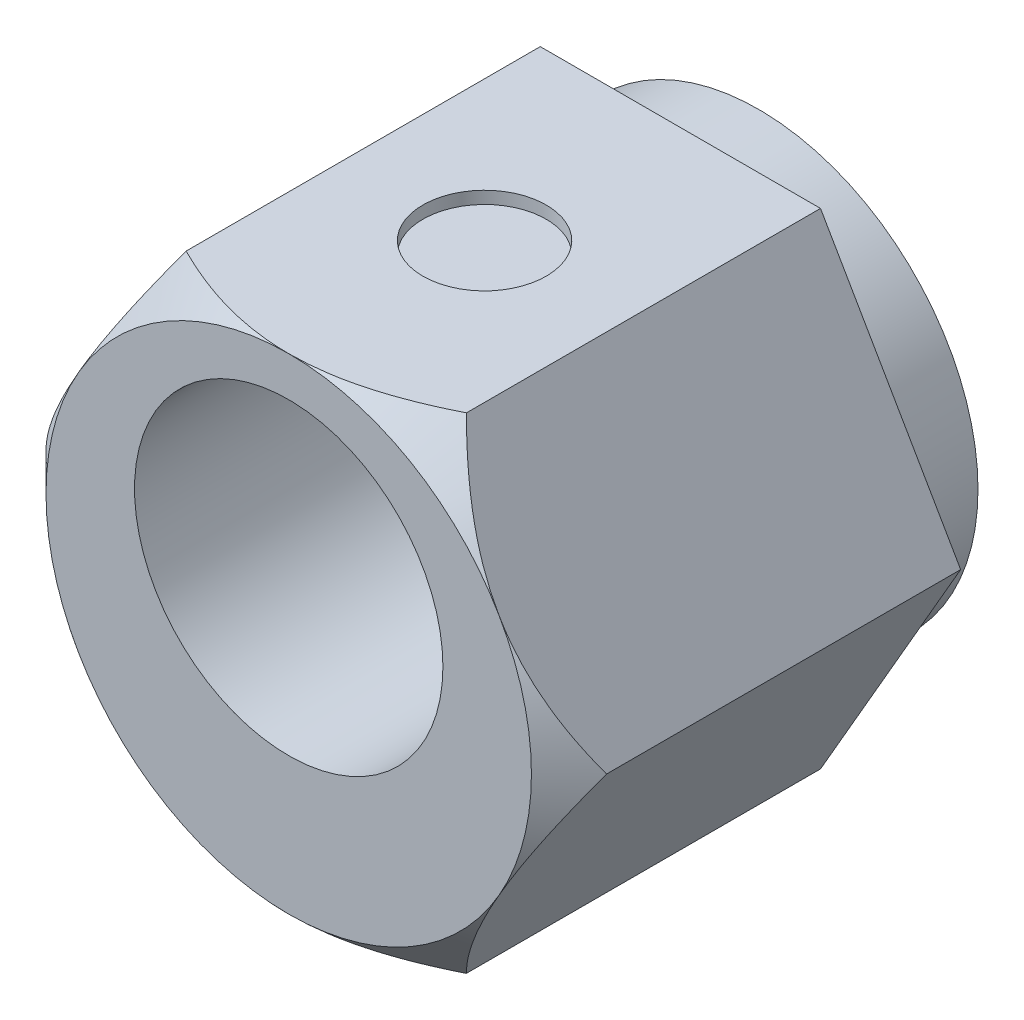
ISO-10303-21;
HEADER;
FILE_DESCRIPTION(('STEP AP214'),'2;1');
FILE_NAME('part.step','',(''),(''),'','','');
FILE_SCHEMA(('AUTOMOTIVE_DESIGN { 1 0 10303 214 1 1 1 1 }'));
ENDSEC;
DATA;
#1=APPLICATION_CONTEXT('core data for automotive mechanical design processes');
#2=APPLICATION_PROTOCOL_DEFINITION('international standard','automotive_design',2000,#1);
#3=PRODUCT_CONTEXT('',#1,'mechanical');
#4=PRODUCT('Part','Part','',(#3));
#5=PRODUCT_RELATED_PRODUCT_CATEGORY('part','',(#4));
#6=PRODUCT_DEFINITION_FORMATION('','',#4);
#7=PRODUCT_DEFINITION_CONTEXT('part definition',#1,'design');
#8=PRODUCT_DEFINITION('design','',#6,#7);
#9=PRODUCT_DEFINITION_SHAPE('','',#8);
#10=(LENGTH_UNIT() NAMED_UNIT(*) SI_UNIT(.MILLI.,.METRE.));
#11=(NAMED_UNIT(*) PLANE_ANGLE_UNIT() SI_UNIT($,.RADIAN.));
#12=(NAMED_UNIT(*) SI_UNIT($,.STERADIAN.) SOLID_ANGLE_UNIT());
#13=UNCERTAINTY_MEASURE_WITH_UNIT(LENGTH_MEASURE(1.E-05),#10,'distance_accuracy_value','');
#14=(GEOMETRIC_REPRESENTATION_CONTEXT(3) GLOBAL_UNCERTAINTY_ASSIGNED_CONTEXT((#13)) GLOBAL_UNIT_ASSIGNED_CONTEXT((#10,
#11,#12)) REPRESENTATION_CONTEXT('',''));
#15=CARTESIAN_POINT('',(0.,0.,0.));
#16=DIRECTION('',(0.,0.,1.));
#17=DIRECTION('',(1.,0.,0.));
#18=AXIS2_PLACEMENT_3D('',#15,#16,#17);
#19=CARTESIAN_POINT('',(2.27187330926118,-3.935,6.35));
#20=DIRECTION('',(-0.866025403784439,0.5,0.));
#21=DIRECTION('',(-0.5,-0.866025403784439,0.));
#22=AXIS2_PLACEMENT_3D('',#19,#20,#21);
#23=PLANE('',#22);
#24=CARTESIAN_POINT('',(2.27175783920734,-3.9352,5.74113790702225));
#25=CARTESIAN_POINT('',(2.31082331662368,-3.86753660829296,5.78019939782444));
#26=CARTESIAN_POINT('',(2.35018773661435,-3.79935543285864,5.81806250313159));
#27=CARTESIAN_POINT('',(2.42957604163856,-3.66185085502993,5.8910266504742));
#28=CARTESIAN_POINT('',(2.46960027263841,-3.59252685340433,5.92612618389363));
#29=CARTESIAN_POINT('',(2.59112694872726,-3.38203647594347,6.02703083232341));
#30=CARTESIAN_POINT('',(2.67366225000178,-3.23908114071799,6.08801147413054));
#31=CARTESIAN_POINT('',(2.84006902700017,-2.950856148233,6.19244398855424));
#32=CARTESIAN_POINT('',(2.9238984692984,-2.8056592950023,6.23615884690859));
#33=CARTESIAN_POINT('',(3.09340844196596,-2.51205940995248,6.30351651032578));
#34=CARTESIAN_POINT('',(3.17908378087713,-2.36366537000264,6.32720957015581));
#35=CARTESIAN_POINT('',(3.3267417531764,-2.10791425983772,6.34858629027159));
#36=CARTESIAN_POINT('',(3.38853414373876,-2.00088669986256,6.35175001817081));
#37=CARTESIAN_POINT('',(3.51201863282563,-1.78700529081743,6.3464170080399));
#38=CARTESIAN_POINT('',(3.57371068860348,-1.68015151578681,6.33791618237832));
#39=CARTESIAN_POINT('',(3.6965102561679,-1.46745642561775,6.30973894507781));
#40=CARTESIAN_POINT('',(3.75761703631313,-1.36161637771927,6.29005003415299));
#41=CARTESIAN_POINT('',(3.87878112158132,-1.15175402598215,6.24057140696216));
#42=CARTESIAN_POINT('',(3.93883850679851,-1.04773158341625,6.21078246514532));
#43=CARTESIAN_POINT('',(4.04545500054664,-0.86306639931963,6.14949467580114));
#44=CARTESIAN_POINT('',(4.09225015435056,-0.782014815383253,6.11960721855959));
#45=CARTESIAN_POINT('',(4.1850004009052,-0.621366675936064,6.05501569852719));
#46=CARTESIAN_POINT('',(4.23095546804853,-0.541770164778593,6.02031148918887));
#47=CARTESIAN_POINT('',(4.32188075595423,-0.384282946433077,5.94686444951026));
#48=CARTESIAN_POINT('',(4.36685356279846,-0.306387760019898,5.90813431896725));
#49=CARTESIAN_POINT('',(4.45596632914802,-0.152039921099436,5.82714402443281));
#50=CARTESIAN_POINT('',(4.50010677953052,-0.0755864183679793,5.78488602621755));
#51=CARTESIAN_POINT('',(4.54386208857619,0.000200000000002672,5.74113790702225));
#52=B_SPLINE_CURVE_WITH_KNOTS('',3,(#24,#25,#26,#27,#28,#29,#30,#31,#32,#33,#34,#35,#36,#37,#38,
#39,#40,#41,#42,#43,#44,#45,#46,#47,#48,#49,#50,#51),.UNSPECIFIED.,.F.,.F.,(4,2,2,2,2,2,2,2,2,2,
2,2,2,4),(0.,0.262034024169244,0.524210113306116,1.05139312717679,1.57020425028876,
2.08770925517824,2.45806190309844,2.82854436754425,3.19944154962779,3.57031029852357,
3.86491210567521,4.15952287791768,4.45323098658818,4.74676009388411),.UNSPECIFIED.);
#53=CARTESIAN_POINT('',(2.27187330926118,-3.935,5.74125338147763));
#54=VERTEX_POINT('',#53);
#55=CARTESIAN_POINT('',(3.40780996389177,-1.9675,6.35));
#56=VERTEX_POINT('',#55);
#57=EDGE_CURVE('E250',#54,#56,#52,.T.);
#58=ORIENTED_EDGE('',*,*,#57,.F.);
#59=DIRECTION('',(0.,0.,-1.));
#60=VECTOR('',#59,1.);
#61=CARTESIAN_POINT('',(2.27187330926118,-3.935,6.35));
#62=LINE('',#61,#60);
#63=CARTESIAN_POINT('',(2.27187330926118,-3.935,0.));
#64=VERTEX_POINT('',#63);
#65=EDGE_CURVE('E224',#54,#64,#62,.T.);
#66=ORIENTED_EDGE('',*,*,#65,.T.);
#67=DIRECTION('',(0.5,0.866025403784439,0.));
#68=VECTOR('',#67,1.);
#69=CARTESIAN_POINT('',(2.27187330926118,-3.935,0.));
#70=LINE('',#69,#68);
#71=CARTESIAN_POINT('',(4.54374661852235,0.,0.));
#72=VERTEX_POINT('',#71);
#73=EDGE_CURVE('E240',#64,#72,#70,.T.);
#74=ORIENTED_EDGE('',*,*,#73,.T.);
#75=DIRECTION('',(0.,0.,-1.));
#76=VECTOR('',#75,1.);
#77=CARTESIAN_POINT('',(4.54374661852235,0.,6.35));
#78=LINE('',#77,#76);
#79=CARTESIAN_POINT('',(4.54374661852235,0.,5.74125338147763));
#80=VERTEX_POINT('',#79);
#81=EDGE_CURVE('E214',#80,#72,#78,.T.);
#82=ORIENTED_EDGE('',*,*,#81,.F.);
#83=EDGE_CURVE('E176',#56,#80,#52,.T.);
#84=ORIENTED_EDGE('',*,*,#83,.F.);
#85=EDGE_LOOP('',(#58,#66,#74,#82,#84));
#86=FACE_BOUND('',#85,.T.);
#87=ADVANCED_FACE('F34',(#86),#23,.F.);
#88=CARTESIAN_POINT('',(4.54374661852235,0.,6.35));
#89=DIRECTION('',(-0.866025403784439,-0.5,0.));
#90=DIRECTION('',(0.5,-0.866025403784439,0.));
#91=AXIS2_PLACEMENT_3D('',#88,#89,#90);
#92=PLANE('',#91);
#93=CARTESIAN_POINT('',(4.54386208857619,-0.00019999999999746,5.74113790702226));
#94=CARTESIAN_POINT('',(4.50479661115985,0.0674633917070432,5.78019939782444));
#95=CARTESIAN_POINT('',(4.46543219116918,0.135644567141366,5.81806250313159));
#96=CARTESIAN_POINT('',(4.38604388614497,0.273149144970073,5.8910266504742));
#97=CARTESIAN_POINT('',(4.34601965514512,0.342473146595676,5.92612618389363));
#98=CARTESIAN_POINT('',(4.22449297905627,0.552963524056532,6.02703083232341));
#99=CARTESIAN_POINT('',(4.14195767778175,0.695918859282011,6.08801147413054));
#100=CARTESIAN_POINT('',(3.97555090078336,0.984143851766998,6.19244398855424));
#101=CARTESIAN_POINT('',(3.89172145848513,1.1293407049977,6.23615884690859));
#102=CARTESIAN_POINT('',(3.72221148581758,1.42294059004751,6.30351651032578));
#103=CARTESIAN_POINT('',(3.6365361469064,1.57133462999736,6.32720957015581));
#104=CARTESIAN_POINT('',(3.48887817460714,1.82708574016228,6.34858629027159));
#105=CARTESIAN_POINT('',(3.42708578404477,1.93411330013744,6.35175001817081));
#106=CARTESIAN_POINT('',(3.30360129495791,2.14799470918257,6.3464170080399));
#107=CARTESIAN_POINT('',(3.24190923918005,2.25484848421319,6.33791618237832));
#108=CARTESIAN_POINT('',(3.11910967161564,2.46754357438224,6.30973894507781));
#109=CARTESIAN_POINT('',(3.0580028914704,2.57338362228073,6.29005003415299));
#110=CARTESIAN_POINT('',(2.93683880620221,2.78324597401784,6.24057140696216));
#111=CARTESIAN_POINT('',(2.87678142098502,2.88726841658375,6.21078246514531));
#112=CARTESIAN_POINT('',(2.77016492723689,3.07193360068037,6.14949467580113));
#113=CARTESIAN_POINT('',(2.72336977343298,3.15298518461674,6.11960721855959));
#114=CARTESIAN_POINT('',(2.63061952687833,3.31363332406393,6.05501569852719));
#115=CARTESIAN_POINT('',(2.58466445973501,3.3932298352214,6.02031148918887));
#116=CARTESIAN_POINT('',(2.4937391718293,3.55071705356692,5.94686444951026));
#117=CARTESIAN_POINT('',(2.44876636498507,3.6286122399801,5.90813431896725));
#118=CARTESIAN_POINT('',(2.35965359863551,3.78296007890056,5.82714402443281));
#119=CARTESIAN_POINT('',(2.31551314825301,3.85941358163202,5.78488602621755));
#120=CARTESIAN_POINT('',(2.27175783920734,3.9352,5.74113790702225));
#121=B_SPLINE_CURVE_WITH_KNOTS('',3,(#93,#94,#95,#96,#97,#98,#99,#100,#101,#102,#103,#104,#105,
#106,#107,#108,#109,#110,#111,#112,#113,#114,#115,#116,#117,#118,#119,#120),.UNSPECIFIED.,.F.,
.F.,(4,2,2,2,2,2,2,2,2,2,2,2,2,4),(0.,0.262034024169244,0.524210113306116,1.05139312717678,
1.57020425028876,2.08770925517823,2.45806190309843,2.82854436754424,3.19944154962778,
3.57031029852356,3.8649121056752,4.15952287791767,4.45323098658817,4.7467600938841),.UNSPECIFIED.);
#122=CARTESIAN_POINT('',(3.40780996389177,1.9675,6.35));
#123=VERTEX_POINT('',#122);
#124=EDGE_CURVE('E174',#80,#123,#121,.T.);
#125=ORIENTED_EDGE('',*,*,#124,.F.);
#126=ORIENTED_EDGE('',*,*,#81,.T.);
#127=DIRECTION('',(-0.5,0.866025403784439,0.));
#128=VECTOR('',#127,1.);
#129=CARTESIAN_POINT('',(4.54374661852235,0.,0.));
#130=LINE('',#129,#128);
#131=CARTESIAN_POINT('',(2.27187330926118,3.935,0.));
#132=VERTEX_POINT('',#131);
#133=EDGE_CURVE('E237',#72,#132,#130,.T.);
#134=ORIENTED_EDGE('',*,*,#133,.T.);
#135=DIRECTION('',(0.,0.,-1.));
#136=VECTOR('',#135,1.);
#137=CARTESIAN_POINT('',(2.27187330926118,3.935,6.35));
#138=LINE('',#137,#136);
#139=CARTESIAN_POINT('',(2.27187330926118,3.935,5.74125338147763));
#140=VERTEX_POINT('',#139);
#141=EDGE_CURVE('E217',#140,#132,#138,.T.);
#142=ORIENTED_EDGE('',*,*,#141,.F.);
#143=EDGE_CURVE('E169',#123,#140,#121,.T.);
#144=ORIENTED_EDGE('',*,*,#143,.F.);
#145=EDGE_LOOP('',(#125,#126,#134,#142,#144));
#146=FACE_BOUND('',#145,.T.);
#147=ADVANCED_FACE('F182',(#146),#92,.F.);
#148=CARTESIAN_POINT('',(2.27187330926118,3.935,6.35));
#149=DIRECTION('',(0.,-1.,0.));
#150=DIRECTION('',(0.,0.,-1.));
#151=AXIS2_PLACEMENT_3D('',#148,#149,#150);
#152=PLANE('',#151);
#153=CARTESIAN_POINT('',(0.,3.935,3.175));
#154=DIRECTION('',(0.,1.,0.));
#155=DIRECTION('',(0.,0.,1.));
#156=AXIS2_PLACEMENT_3D('',#153,#154,#155);
#157=CIRCLE('',#156,1.);
#158=CARTESIAN_POINT('',(0.,3.935,4.175));
#159=VERTEX_POINT('',#158);
#160=EDGE_CURVE('E248',#159,#159,#157,.T.);
#161=ORIENTED_EDGE('',*,*,#160,.F.);
#162=EDGE_LOOP('',(#161));
#163=FACE_BOUND('',#162,.T.);
#164=CARTESIAN_POINT('',(-13.1236901526752,3.935,-3.41592946567602));
#165=CARTESIAN_POINT('',(-12.8031195440559,3.935,-3.10889289114892));
#166=CARTESIAN_POINT('',(-12.4821108648223,3.935,-2.8023113742663));
#167=CARTESIAN_POINT('',(-11.8389221735785,3.935,-2.19034787753257));
#168=CARTESIAN_POINT('',(-11.5167421042617,3.935,-1.88496595793061));
#169=CARTESIAN_POINT('',(-10.8700823429703,3.935,-1.27490570063593));
#170=CARTESIAN_POINT('',(-10.5455988029611,3.935,-0.970231438129506));
#171=CARTESIAN_POINT('',(-9.89478736268741,3.935,-0.362879907042088));
#172=CARTESIAN_POINT('',(-9.56845952755677,3.935,-0.0602025687450328));
#173=CARTESIAN_POINT('',(-8.87472102038576,3.935,0.578081233468633));
#174=CARTESIAN_POINT('',(-8.50700688270092,3.935,0.913358297375564));
#175=CARTESIAN_POINT('',(-7.76731901306219,3.935,1.57929169459804));
#176=CARTESIAN_POINT('',(-7.39534478298294,3.935,1.90994747730821));
#177=CARTESIAN_POINT('',(-6.83307463315123,3.935,2.40040387622325));
#178=CARTESIAN_POINT('',(-6.64508172586861,3.935,2.56284332383779));
#179=CARTESIAN_POINT('',(-6.26720974784876,3.935,2.88551089592677));
#180=CARTESIAN_POINT('',(-6.0773307119418,3.935,3.04573906110586));
#181=CARTESIAN_POINT('',(-5.69527444823266,3.935,3.36335940486739));
#182=CARTESIAN_POINT('',(-5.50309768174997,3.935,3.52075213733078));
#183=CARTESIAN_POINT('',(-5.11582420868297,3.935,3.83189555157435));
#184=CARTESIAN_POINT('',(-4.9207276819186,3.935,3.98564645615061));
#185=CARTESIAN_POINT('',(-4.59066963103563,3.935,4.23923777501762));
#186=CARTESIAN_POINT('',(-4.45672034623056,3.935,4.34039432268771));
#187=CARTESIAN_POINT('',(-4.18679523009464,3.935,4.53998371954863));
#188=CARTESIAN_POINT('',(-4.05081933693232,3.935,4.63841648537453));
#189=CARTESIAN_POINT('',(-3.77620153052435,3.935,4.83207201127131));
#190=CARTESIAN_POINT('',(-3.63755500466042,3.935,4.92728825343199));
#191=CARTESIAN_POINT('',(-3.35739305428911,3.935,5.11340985393257));
#192=CARTESIAN_POINT('',(-3.21587776632741,3.935,5.20431541676518));
#193=CARTESIAN_POINT('',(-2.93248486646283,3.935,5.37873022055762));
#194=CARTESIAN_POINT('',(-2.79067930340835,3.935,5.46235583033874));
#195=CARTESIAN_POINT('',(-2.50319310985428,3.935,5.62281496077693));
#196=CARTESIAN_POINT('',(-2.35751148463348,3.935,5.69964671561026));
#197=CARTESIAN_POINT('',(-2.06226709210795,3.935,5.84420557337593));
#198=CARTESIAN_POINT('',(-1.91271910896614,3.935,5.9119625750583));
#199=CARTESIAN_POINT('',(-1.60896116978889,3.935,6.03602304691689));
#200=CARTESIAN_POINT('',(-1.45475443067069,3.935,6.09233422190501));
#201=CARTESIAN_POINT('',(-1.20045367872989,3.935,6.17200976074409));
#202=CARTESIAN_POINT('',(-1.10174756702824,3.935,6.19981119655868));
#203=CARTESIAN_POINT('',(-0.902705453338799,3.935,6.24893693510281));
#204=CARTESIAN_POINT('',(-0.802369277526225,3.935,6.27026054221768));
#205=CARTESIAN_POINT('',(-0.600677306359168,3.935,6.30565166626418));
#206=CARTESIAN_POINT('',(-0.499324791055474,3.935,6.31973767616047));
#207=CARTESIAN_POINT('',(-0.295844893857511,3.935,6.34019311884467));
#208=CARTESIAN_POINT('',(-0.19371755506928,3.935,6.34656297778597));
#209=CARTESIAN_POINT('',(0.0317597016033228,3.935,6.35179824290066));
#210=CARTESIAN_POINT('',(0.155156367773224,3.935,6.34885168911598));
#211=CARTESIAN_POINT('',(0.401139414943979,3.935,6.33151175443196));
#212=CARTESIAN_POINT('',(0.523725672494003,3.935,6.31711666830712));
#213=CARTESIAN_POINT('',(0.76765747972916,3.935,6.27763599318921));
#214=CARTESIAN_POINT('',(0.888995881860383,3.935,6.25250681522559));
#215=CARTESIAN_POINT('',(1.12929608238302,3.935,6.19281457883945));
#216=CARTESIAN_POINT('',(1.24825763094315,3.935,6.15825053425755));
#217=CARTESIAN_POINT('',(1.60548760242359,3.935,6.04112194575606));
#218=CARTESIAN_POINT('',(1.83964307730525,3.935,5.94593263396749));
#219=CARTESIAN_POINT('',(2.18280484497915,3.935,5.78626578439461));
#220=CARTESIAN_POINT('',(2.29595874697007,3.935,5.73016346030901));
#221=CARTESIAN_POINT('',(2.51984341612594,3.935,5.61330683052985));
#222=CARTESIAN_POINT('',(2.63057453648393,3.935,5.55255320879083));
#223=CARTESIAN_POINT('',(2.8514014363745,3.935,5.42635931686595));
#224=CARTESIAN_POINT('',(2.96146589768556,3.935,5.36086477127302));
#225=CARTESIAN_POINT('',(3.17961590777305,3.935,5.22666129988295));
#226=CARTESIAN_POINT('',(3.28770141327481,3.935,5.15795230391057));
#227=CARTESIAN_POINT('',(3.50203858606768,3.935,5.01794026649113));
#228=CARTESIAN_POINT('',(3.60829177117163,3.935,4.94663954076899));
#229=CARTESIAN_POINT('',(3.81927009139693,3.935,4.80182751727686));
#230=CARTESIAN_POINT('',(3.92399528884536,3.935,4.7283163100496));
#231=CARTESIAN_POINT('',(4.26762948621968,3.935,4.48252454868428));
#232=CARTESIAN_POINT('',(4.50369936164225,3.935,4.30627340705269));
#233=CARTESIAN_POINT('',(4.97067864192371,3.935,3.94704122053123));
#234=CARTESIAN_POINT('',(5.20158705610022,3.935,3.764058901202));
#235=CARTESIAN_POINT('',(5.65961269187026,3.935,3.39316510070156));
#236=CARTESIAN_POINT('',(5.88672773089495,3.935,3.20525093164967));
#237=CARTESIAN_POINT('',(6.33795252588463,3.935,2.82584582987841));
#238=CARTESIAN_POINT('',(6.56206218345843,3.935,2.63435478054663));
#239=CARTESIAN_POINT('',(7.00849695323274,3.935,2.24816692555583));
#240=CARTESIAN_POINT('',(7.23081606517612,3.935,2.05346319618324));
#241=CARTESIAN_POINT('',(7.67357642035214,3.935,1.66192866942992));
#242=CARTESIAN_POINT('',(7.89401763332101,3.935,1.46509783788486));
#243=CARTESIAN_POINT('',(8.55293598005197,3.935,0.872246101755066));
#244=CARTESIAN_POINT('',(8.9891655383951,3.935,0.473728323137581));
#245=CARTESIAN_POINT('',(9.80466067684911,3.935,-0.278818950927105));
#246=CARTESIAN_POINT('',(10.1843882160902,3.935,-0.63235001731397));
#247=CARTESIAN_POINT('',(10.941579142227,3.935,-1.34190416880677));
#248=CARTESIAN_POINT('',(11.3190422963122,3.935,-1.69792750226642));
#249=CARTESIAN_POINT('',(12.0704413810763,3.935,-2.41009605435369));
#250=CARTESIAN_POINT('',(12.4443855483041,3.935,-2.76623259460942));
#251=CARTESIAN_POINT('',(13.1908789142557,3.935,-3.47987607095009));
#252=CARTESIAN_POINT('',(13.5634282742904,3.935,-3.83738283824041));
#253=CARTESIAN_POINT('',(13.935484735638,3.935,-4.19539915945703));
#254=B_SPLINE_CURVE_WITH_KNOTS('',3,(#164,#165,#166,#167,#168,#169,#170,#171,#172,#173,#174,
#175,#176,#177,#178,#179,#180,#181,#182,#183,#184,#185,#186,#187,#188,#189,#190,#191,#192,#193,
#194,#195,#196,#197,#198,#199,#200,#201,#202,#203,#204,#205,#206,#207,#208,#209,#210,#211,#212,
#213,#214,#215,#216,#217,#218,#219,#220,#221,#222,#223,#224,#225,#226,#227,#228,#229,#230,#231,
#232,#233,#234,#235,#236,#237,#238,#239,#240,#241,#242,#243,#244,#245,#246,#247,#248,#249,#250,
#251,#252,#253),.UNSPECIFIED.,.F.,.F.,(4,2,2,2,2,2,2,2,2,2,2,2,2,2,2,2,2,2,2,2,2,2,2,2,2,2,2,2,
2,2,2,2,2,2,2,2,2,2,2,2,2,2,2,2,4),(0.,1.33166737410768,2.66340079661562,3.99870110863636,
5.33395455368537,6.8267872394219,8.31979629882266,9.06513664918736,9.81046326119244,
10.5556426648754,11.3007763623614,11.8043123221086,12.3078636762281,12.8123807031937,
13.3168737725696,13.8106110967637,14.3044763757059,14.7966722298962,15.2885356547855,
15.5959914578669,15.9034802650982,16.2101794433857,16.5168616822885,16.886591181482,
17.256375761122,17.6276764536979,17.9990159705603,18.755162227821,19.1340132033387,
19.5128085769528,19.8969796934452,20.2811592007632,20.66500349517,21.0488320884306,
21.9324494577438,22.8162349955618,23.7005126350207,24.5848191539302,25.4713783562851,
26.3579518192813,28.1304708443723,29.6869288193223,31.2435441676875,32.792736046513,
34.3417428537419),.UNSPECIFIED.);
#255=CARTESIAN_POINT('',(0.,3.935,6.35));
#256=VERTEX_POINT('',#255);
#257=EDGE_CURVE('E175',#140,#256,#254,.F.);
#258=ORIENTED_EDGE('',*,*,#257,.F.);
#259=ORIENTED_EDGE('',*,*,#141,.T.);
#260=DIRECTION('',(-1.,0.,0.));
#261=VECTOR('',#260,1.);
#262=CARTESIAN_POINT('',(2.27187330926118,3.935,0.));
#263=LINE('',#262,#261);
#264=CARTESIAN_POINT('',(-2.27187330926118,3.935,0.));
#265=VERTEX_POINT('',#264);
#266=EDGE_CURVE('E234',#132,#265,#263,.T.);
#267=ORIENTED_EDGE('',*,*,#266,.T.);
#268=DIRECTION('',(0.,0.,-1.));
#269=VECTOR('',#268,1.);
#270=CARTESIAN_POINT('',(-2.27187330926118,3.935,6.35));
#271=LINE('',#270,#269);
#272=CARTESIAN_POINT('',(-2.27187330926118,3.935,5.74125338147763));
#273=VERTEX_POINT('',#272);
#274=EDGE_CURVE('E219',#273,#265,#271,.T.);
#275=ORIENTED_EDGE('',*,*,#274,.F.);
#276=EDGE_CURVE('E112',#256,#273,#254,.F.);
#277=ORIENTED_EDGE('',*,*,#276,.F.);
#278=EDGE_LOOP('',(#258,#259,#267,#275,#277));
#279=FACE_BOUND('',#278,.T.);
#280=ADVANCED_FACE('F185',(#163,#279),#152,.F.);
#281=CARTESIAN_POINT('',(-2.27187330926118,3.935,6.35));
#282=DIRECTION('',(0.866025403784439,-0.5,0.));
#283=DIRECTION('',(0.5,0.866025403784439,0.));
#284=AXIS2_PLACEMENT_3D('',#281,#282,#283);
#285=PLANE('',#284);
#286=CARTESIAN_POINT('',(-2.27175783920734,3.9352,5.74113790702225));
#287=CARTESIAN_POINT('',(-2.31082331662368,3.86753660829296,5.78019939782443));
#288=CARTESIAN_POINT('',(-2.35018773661435,3.79935543285864,5.81806250313158));
#289=CARTESIAN_POINT('',(-2.42957604163856,3.66185085502993,5.8910266504742));
#290=CARTESIAN_POINT('',(-2.46960027263841,3.59252685340433,5.92612618389363));
#291=CARTESIAN_POINT('',(-2.59112694872726,3.38203647594347,6.02703083232341));
#292=CARTESIAN_POINT('',(-2.67366225000178,3.23908114071799,6.08801147413053));
#293=CARTESIAN_POINT('',(-2.84006902700017,2.950856148233,6.19244398855424));
#294=CARTESIAN_POINT('',(-2.9238984692984,2.8056592950023,6.23615884690859));
#295=CARTESIAN_POINT('',(-3.09340844196596,2.51205940995248,6.30351651032578));
#296=CARTESIAN_POINT('',(-3.17908378087713,2.36366537000264,6.32720957015581));
#297=CARTESIAN_POINT('',(-3.3267417531764,2.10791425983772,6.34858629027159));
#298=CARTESIAN_POINT('',(-3.38853414373876,2.00088669986256,6.35175001817081));
#299=CARTESIAN_POINT('',(-3.51201863282563,1.78700529081743,6.3464170080399));
#300=CARTESIAN_POINT('',(-3.57371068860349,1.68015151578681,6.33791618237832));
#301=CARTESIAN_POINT('',(-3.6965102561679,1.46745642561775,6.30973894507781));
#302=CARTESIAN_POINT('',(-3.75761703631313,1.36161637771927,6.29005003415299));
#303=CARTESIAN_POINT('',(-3.87878112158132,1.15175402598215,6.24057140696216));
#304=CARTESIAN_POINT('',(-3.93883850679851,1.04773158341625,6.21078246514531));
#305=CARTESIAN_POINT('',(-4.04545500054664,0.86306639931963,6.14949467580113));
#306=CARTESIAN_POINT('',(-4.09225015435056,0.782014815383252,6.11960721855959));
#307=CARTESIAN_POINT('',(-4.18500040090521,0.621366675936063,6.05501569852719));
#308=CARTESIAN_POINT('',(-4.23095546804853,0.541770164778593,6.02031148918887));
#309=CARTESIAN_POINT('',(-4.32188075595424,0.384282946433078,5.94686444951026));
#310=CARTESIAN_POINT('',(-4.36685356279846,0.306387760019899,5.90813431896725));
#311=CARTESIAN_POINT('',(-4.45596632914803,0.152039921099437,5.82714402443281));
#312=CARTESIAN_POINT('',(-4.50010677953052,0.07558641836798,5.78488602621755));
#313=CARTESIAN_POINT('',(-4.54386208857619,-0.000200000000002143,5.74113790702225));
#314=B_SPLINE_CURVE_WITH_KNOTS('',3,(#286,#287,#288,#289,#290,#291,#292,#293,#294,#295,#296,
#297,#298,#299,#300,#301,#302,#303,#304,#305,#306,#307,#308,#309,#310,#311,#312,#313),
.UNSPECIFIED.,.F.,.F.,(4,2,2,2,2,2,2,2,2,2,2,2,2,4),(0.,0.262034024169245,0.524210113306118,
1.05139312717679,1.57020425028876,2.08770925517824,2.45806190309844,2.82854436754425,
3.19944154962779,3.57031029852357,3.86491210567521,4.15952287791768,4.45323098658818,
4.74676009388411),.UNSPECIFIED.);
#315=CARTESIAN_POINT('',(-3.40780996389176,1.9675,6.35));
#316=VERTEX_POINT('',#315);
#317=EDGE_CURVE('E106',#273,#316,#314,.T.);
#318=ORIENTED_EDGE('',*,*,#317,.F.);
#319=ORIENTED_EDGE('',*,*,#274,.T.);
#320=DIRECTION('',(-0.5,-0.866025403784439,0.));
#321=VECTOR('',#320,1.);
#322=CARTESIAN_POINT('',(-2.27187330926118,3.935,0.));
#323=LINE('',#322,#321);
#324=CARTESIAN_POINT('',(-4.54374661852236,0.,0.));
#325=VERTEX_POINT('',#324);
#326=EDGE_CURVE('E232',#265,#325,#323,.T.);
#327=ORIENTED_EDGE('',*,*,#326,.T.);
#328=DIRECTION('',(0.,0.,-1.));
#329=VECTOR('',#328,1.);
#330=CARTESIAN_POINT('',(-4.54374661852236,0.,6.35));
#331=LINE('',#330,#329);
#332=CARTESIAN_POINT('',(-4.54374661852236,0.,5.74125338147763));
#333=VERTEX_POINT('',#332);
#334=EDGE_CURVE('E130',#333,#325,#331,.T.);
#335=ORIENTED_EDGE('',*,*,#334,.F.);
#336=EDGE_CURVE('E116',#316,#333,#314,.T.);
#337=ORIENTED_EDGE('',*,*,#336,.F.);
#338=EDGE_LOOP('',(#318,#319,#327,#335,#337));
#339=FACE_BOUND('',#338,.T.);
#340=ADVANCED_FACE('F128',(#339),#285,.F.);
#341=CARTESIAN_POINT('',(-4.54374661852236,0.,6.35));
#342=DIRECTION('',(0.866025403784439,0.5,0.));
#343=DIRECTION('',(-0.5,0.866025403784439,0.));
#344=AXIS2_PLACEMENT_3D('',#341,#342,#343);
#345=PLANE('',#344);
#346=CARTESIAN_POINT('',(-4.54386208857619,0.000199999999998345,5.74113790702225));
#347=CARTESIAN_POINT('',(-4.50479661115985,-0.0674633917070421,5.78019939782444));
#348=CARTESIAN_POINT('',(-4.46543219116918,-0.135644567141364,5.81806250313159));
#349=CARTESIAN_POINT('',(-4.38604388614497,-0.273149144970072,5.8910266504742));
#350=CARTESIAN_POINT('',(-4.34601965514513,-0.342473146595675,5.92612618389363));
#351=CARTESIAN_POINT('',(-4.22449297905627,-0.552963524056533,6.02703083232341));
#352=CARTESIAN_POINT('',(-4.14195767778175,-0.695918859282012,6.08801147413053));
#353=CARTESIAN_POINT('',(-3.97555090078336,-0.984143851766999,6.19244398855424));
#354=CARTESIAN_POINT('',(-3.89172145848513,-1.1293407049977,6.23615884690859));
#355=CARTESIAN_POINT('',(-3.72221148581758,-1.42294059004752,6.30351651032578));
#356=CARTESIAN_POINT('',(-3.6365361469064,-1.57133462999736,6.32720957015581));
#357=CARTESIAN_POINT('',(-3.48887817460714,-1.82708574016228,6.34858629027159));
#358=CARTESIAN_POINT('',(-3.42708578404477,-1.93411330013744,6.35175001817081));
#359=CARTESIAN_POINT('',(-3.30360129495791,-2.14799470918257,6.3464170080399));
#360=CARTESIAN_POINT('',(-3.24190923918005,-2.25484848421319,6.33791618237832));
#361=CARTESIAN_POINT('',(-3.11910967161564,-2.46754357438224,6.3097389450778));
#362=CARTESIAN_POINT('',(-3.0580028914704,-2.57338362228073,6.29005003415298));
#363=CARTESIAN_POINT('',(-2.93683880620221,-2.78324597401785,6.24057140696216));
#364=CARTESIAN_POINT('',(-2.87678142098502,-2.88726841658375,6.21078246514531));
#365=CARTESIAN_POINT('',(-2.77016492723689,-3.07193360068037,6.14949467580113));
#366=CARTESIAN_POINT('',(-2.72336977343298,-3.15298518461675,6.11960721855958));
#367=CARTESIAN_POINT('',(-2.63061952687833,-3.31363332406393,6.05501569852719));
#368=CARTESIAN_POINT('',(-2.58466445973501,-3.39322983522141,6.02031148918886));
#369=CARTESIAN_POINT('',(-2.4937391718293,-3.55071705356692,5.94686444951026));
#370=CARTESIAN_POINT('',(-2.44876636498508,-3.6286122399801,5.90813431896725));
#371=CARTESIAN_POINT('',(-2.35965359863551,-3.78296007890056,5.8271440244328));
#372=CARTESIAN_POINT('',(-2.31551314825301,-3.85941358163202,5.78488602621755));
#373=CARTESIAN_POINT('',(-2.27175783920734,-3.9352,5.74113790702225));
#374=B_SPLINE_CURVE_WITH_KNOTS('',3,(#346,#347,#348,#349,#350,#351,#352,#353,#354,#355,#356,
#357,#358,#359,#360,#361,#362,#363,#364,#365,#366,#367,#368,#369,#370,#371,#372,#373),
.UNSPECIFIED.,.F.,.F.,(4,2,2,2,2,2,2,2,2,2,2,2,2,4),(0.,0.262034024169244,0.524210113306117,
1.05139312717678,1.57020425028876,2.08770925517823,2.45806190309843,2.82854436754425,
3.19944154962778,3.57031029852356,3.86491210567521,4.15952287791767,4.45323098658817,
4.7467600938841),.UNSPECIFIED.);
#375=CARTESIAN_POINT('',(-3.40780996389176,-1.9675,6.35));
#376=VERTEX_POINT('',#375);
#377=EDGE_CURVE('E121',#333,#376,#374,.T.);
#378=ORIENTED_EDGE('',*,*,#377,.F.);
#379=ORIENTED_EDGE('',*,*,#334,.T.);
#380=DIRECTION('',(0.5,-0.866025403784439,0.));
#381=VECTOR('',#380,1.);
#382=CARTESIAN_POINT('',(-4.54374661852236,0.,0.));
#383=LINE('',#382,#381);
#384=CARTESIAN_POINT('',(-2.27187330926118,-3.935,0.));
#385=VERTEX_POINT('',#384);
#386=EDGE_CURVE('E229',#325,#385,#383,.T.);
#387=ORIENTED_EDGE('',*,*,#386,.T.);
#388=DIRECTION('',(0.,0.,-1.));
#389=VECTOR('',#388,1.);
#390=CARTESIAN_POINT('',(-2.27187330926118,-3.935,6.35));
#391=LINE('',#390,#389);
#392=CARTESIAN_POINT('',(-2.27187330926118,-3.935,5.74125338147763));
#393=VERTEX_POINT('',#392);
#394=EDGE_CURVE('E222',#393,#385,#391,.T.);
#395=ORIENTED_EDGE('',*,*,#394,.F.);
#396=EDGE_CURVE('E131',#376,#393,#374,.T.);
#397=ORIENTED_EDGE('',*,*,#396,.F.);
#398=EDGE_LOOP('',(#378,#379,#387,#395,#397));
#399=FACE_BOUND('',#398,.T.);
#400=ADVANCED_FACE('F276',(#399),#345,.F.);
#401=CARTESIAN_POINT('',(-2.27187330926118,-3.935,6.35));
#402=DIRECTION('',(0.,1.,0.));
#403=DIRECTION('',(-1.,0.,0.));
#404=AXIS2_PLACEMENT_3D('',#401,#402,#403);
#405=PLANE('',#404);
#406=CARTESIAN_POINT('',(-13.1236901526753,-3.935,-3.41592946567604));
#407=CARTESIAN_POINT('',(-12.8031195440559,-3.935,-3.10889289114894));
#408=CARTESIAN_POINT('',(-12.4821108648224,-3.935,-2.80231137426632));
#409=CARTESIAN_POINT('',(-11.8389221735785,-3.935,-2.19034787753258));
#410=CARTESIAN_POINT('',(-11.5167421042617,-3.935,-1.88496595793062));
#411=CARTESIAN_POINT('',(-10.8700823429703,-3.935,-1.27490570063594));
#412=CARTESIAN_POINT('',(-10.5455988029612,-3.935,-0.970231438129515));
#413=CARTESIAN_POINT('',(-9.89478736268742,-3.935,-0.362879907042095));
#414=CARTESIAN_POINT('',(-9.56845952755678,-3.935,-0.0602025687450395));
#415=CARTESIAN_POINT('',(-8.87472102038577,-3.935,0.578081233468628));
#416=CARTESIAN_POINT('',(-8.50700688270092,-3.935,0.913358297375561));
#417=CARTESIAN_POINT('',(-7.76731901306219,-3.935,1.57929169459804));
#418=CARTESIAN_POINT('',(-7.39534478298295,-3.935,1.90994747730821));
#419=CARTESIAN_POINT('',(-6.83307463315124,-3.935,2.40040387622325));
#420=CARTESIAN_POINT('',(-6.64508172586861,-3.935,2.56284332383779));
#421=CARTESIAN_POINT('',(-6.26720974784876,-3.935,2.88551089592678));
#422=CARTESIAN_POINT('',(-6.0773307119418,-3.935,3.04573906110586));
#423=CARTESIAN_POINT('',(-5.69527444823266,-3.935,3.36335940486739));
#424=CARTESIAN_POINT('',(-5.50309768174997,-3.935,3.52075213733078));
#425=CARTESIAN_POINT('',(-5.11582420868297,-3.935,3.83189555157435));
#426=CARTESIAN_POINT('',(-4.9207276819186,-3.935,3.98564645615061));
#427=CARTESIAN_POINT('',(-4.59066963103563,-3.935,4.23923777501762));
#428=CARTESIAN_POINT('',(-4.45672034623056,-3.935,4.34039432268772));
#429=CARTESIAN_POINT('',(-4.18679523009464,-3.935,4.53998371954864));
#430=CARTESIAN_POINT('',(-4.05081933693232,-3.935,4.63841648537453));
#431=CARTESIAN_POINT('',(-3.77620153052434,-3.935,4.83207201127131));
#432=CARTESIAN_POINT('',(-3.63755500466042,-3.935,4.927288253432));
#433=CARTESIAN_POINT('',(-3.35739305428911,-3.935,5.11340985393257));
#434=CARTESIAN_POINT('',(-3.21587776632741,-3.935,5.20431541676518));
#435=CARTESIAN_POINT('',(-2.93248486646282,-3.935,5.37873022055763));
#436=CARTESIAN_POINT('',(-2.79067930340835,-3.935,5.46235583033874));
#437=CARTESIAN_POINT('',(-2.50319310985428,-3.935,5.62281496077693));
#438=CARTESIAN_POINT('',(-2.35751148463348,-3.935,5.69964671561026));
#439=CARTESIAN_POINT('',(-2.06226709210795,-3.935,5.84420557337593));
#440=CARTESIAN_POINT('',(-1.91271910896614,-3.935,5.9119625750583));
#441=CARTESIAN_POINT('',(-1.60896116978889,-3.935,6.0360230469169));
#442=CARTESIAN_POINT('',(-1.45475443067069,-3.935,6.09233422190502));
#443=CARTESIAN_POINT('',(-1.2004536787299,-3.935,6.1720097607441));
#444=CARTESIAN_POINT('',(-1.10174756702824,-3.935,6.19981119655868));
#445=CARTESIAN_POINT('',(-0.902705453338802,-3.935,6.24893693510281));
#446=CARTESIAN_POINT('',(-0.802369277526228,-3.935,6.27026054221768));
#447=CARTESIAN_POINT('',(-0.600677306359172,-3.935,6.30565166626418));
#448=CARTESIAN_POINT('',(-0.499324791055479,-3.935,6.31973767616047));
#449=CARTESIAN_POINT('',(-0.295844893857515,-3.935,6.34019311884467));
#450=CARTESIAN_POINT('',(-0.193717555069284,-3.935,6.34656297778597));
#451=CARTESIAN_POINT('',(0.0317597016033217,-3.935,6.35179824290067));
#452=CARTESIAN_POINT('',(0.155156367773224,-3.935,6.34885168911598));
#453=CARTESIAN_POINT('',(0.40113941494398,-3.935,6.33151175443196));
#454=CARTESIAN_POINT('',(0.523725672494003,-3.935,6.31711666830712));
#455=CARTESIAN_POINT('',(0.76765747972916,-3.935,6.27763599318922));
#456=CARTESIAN_POINT('',(0.888995881860384,-3.935,6.2525068152256));
#457=CARTESIAN_POINT('',(1.12929608238302,-3.935,6.19281457883946));
#458=CARTESIAN_POINT('',(1.24825763094315,-3.935,6.15825053425755));
#459=CARTESIAN_POINT('',(1.60548760242358,-3.935,6.04112194575605));
#460=CARTESIAN_POINT('',(1.83964307730524,-3.935,5.94593263396749));
#461=CARTESIAN_POINT('',(2.18280484497915,-3.935,5.78626578439461));
#462=CARTESIAN_POINT('',(2.29595874697007,-3.935,5.73016346030902));
#463=CARTESIAN_POINT('',(2.51984341612594,-3.935,5.61330683052985));
#464=CARTESIAN_POINT('',(2.63057453648393,-3.935,5.55255320879083));
#465=CARTESIAN_POINT('',(2.8514014363745,-3.935,5.42635931686595));
#466=CARTESIAN_POINT('',(2.96146589768556,-3.935,5.36086477127302));
#467=CARTESIAN_POINT('',(3.17961590777305,-3.935,5.22666129988295));
#468=CARTESIAN_POINT('',(3.28770141327481,-3.935,5.15795230391057));
#469=CARTESIAN_POINT('',(3.50203858606768,-3.935,5.01794026649114));
#470=CARTESIAN_POINT('',(3.60829177117163,-3.935,4.94663954076899));
#471=CARTESIAN_POINT('',(3.81927009139693,-3.935,4.80182751727686));
#472=CARTESIAN_POINT('',(3.92399528884536,-3.935,4.7283163100496));
#473=CARTESIAN_POINT('',(4.26762948621967,-3.935,4.48252454868428));
#474=CARTESIAN_POINT('',(4.50369936164225,-3.935,4.30627340705269));
#475=CARTESIAN_POINT('',(4.97067864192371,-3.935,3.94704122053124));
#476=CARTESIAN_POINT('',(5.20158705610022,-3.935,3.764058901202));
#477=CARTESIAN_POINT('',(5.65961269187026,-3.935,3.39316510070156));
#478=CARTESIAN_POINT('',(5.88672773089495,-3.935,3.20525093164967));
#479=CARTESIAN_POINT('',(6.33795252588463,-3.935,2.82584582987841));
#480=CARTESIAN_POINT('',(6.56206218345843,-3.935,2.63435478054663));
#481=CARTESIAN_POINT('',(7.00849695323274,-3.935,2.24816692555583));
#482=CARTESIAN_POINT('',(7.23081606517612,-3.935,2.05346319618324));
#483=CARTESIAN_POINT('',(7.67357642035214,-3.935,1.66192866942992));
#484=CARTESIAN_POINT('',(7.894017633321,-3.935,1.46509783788487));
#485=CARTESIAN_POINT('',(8.55293598005197,-3.935,0.872246101755067));
#486=CARTESIAN_POINT('',(8.9891655383951,-3.935,0.473728323137581));
#487=CARTESIAN_POINT('',(9.80466067684911,-3.935,-0.278818950927107));
#488=CARTESIAN_POINT('',(10.1843882160902,-3.935,-0.632350017313972));
#489=CARTESIAN_POINT('',(10.941579142227,-3.935,-1.34190416880678));
#490=CARTESIAN_POINT('',(11.3190422963122,-3.935,-1.69792750226642));
#491=CARTESIAN_POINT('',(12.0704413810763,-3.935,-2.41009605435369));
#492=CARTESIAN_POINT('',(12.4443855483041,-3.935,-2.76623259460942));
#493=CARTESIAN_POINT('',(13.1908789142557,-3.935,-3.47987607095009));
#494=CARTESIAN_POINT('',(13.5634282742904,-3.935,-3.83738283824042));
#495=CARTESIAN_POINT('',(13.935484735638,-3.935,-4.19539915945703));
#496=B_SPLINE_CURVE_WITH_KNOTS('',3,(#406,#407,#408,#409,#410,#411,#412,#413,#414,#415,#416,
#417,#418,#419,#420,#421,#422,#423,#424,#425,#426,#427,#428,#429,#430,#431,#432,#433,#434,#435,
#436,#437,#438,#439,#440,#441,#442,#443,#444,#445,#446,#447,#448,#449,#450,#451,#452,#453,#454,
#455,#456,#457,#458,#459,#460,#461,#462,#463,#464,#465,#466,#467,#468,#469,#470,#471,#472,#473,
#474,#475,#476,#477,#478,#479,#480,#481,#482,#483,#484,#485,#486,#487,#488,#489,#490,#491,#492,
#493,#494,#495),.UNSPECIFIED.,.F.,.F.,(4,2,2,2,2,2,2,2,2,2,2,2,2,2,2,2,2,2,2,2,2,2,2,2,2,2,2,2,
2,2,2,2,2,2,2,2,2,2,2,2,2,2,2,2,4),(0.,1.33166737410768,2.66340079661564,3.99870110863637,
5.33395455368539,6.82678723942193,8.3197962988227,9.06513664918739,9.81046326119247,
10.5556426648755,11.3007763623614,11.8043123221086,12.3078636762282,12.8123807031937,
13.3168737725697,13.8106110967637,14.3044763757059,14.7966722298962,15.2885356547856,
15.595991457867,15.9034802650982,16.2101794433857,16.5168616822885,16.886591181482,
17.256375761122,17.6276764536979,17.9990159705604,18.755162227821,19.1340132033388,
19.5128085769529,19.8969796934452,20.2811592007633,20.6650034951701,21.0488320884306,
21.9324494577439,22.8162349955619,23.7005126350207,24.5848191539302,25.4713783562852,
26.3579518192813,28.1304708443723,29.6869288193224,31.2435441676876,32.7927360465131,
34.3417428537419),.UNSPECIFIED.);
#497=CARTESIAN_POINT('',(0.,-3.935,6.35));
#498=VERTEX_POINT('',#497);
#499=EDGE_CURVE('E280',#393,#498,#496,.T.);
#500=ORIENTED_EDGE('',*,*,#499,.F.);
#501=ORIENTED_EDGE('',*,*,#394,.T.);
#502=DIRECTION('',(1.,0.,0.));
#503=VECTOR('',#502,1.);
#504=CARTESIAN_POINT('',(-2.27187330926118,-3.935,0.));
#505=LINE('',#504,#503);
#506=EDGE_CURVE('E226',#385,#64,#505,.T.);
#507=ORIENTED_EDGE('',*,*,#506,.T.);
#508=ORIENTED_EDGE('',*,*,#65,.F.);
#509=EDGE_CURVE('E125',#498,#54,#496,.T.);
#510=ORIENTED_EDGE('',*,*,#509,.F.);
#511=EDGE_LOOP('',(#500,#501,#507,#508,#510));
#512=FACE_BOUND('',#511,.T.);
#513=ADVANCED_FACE('F287',(#512),#405,.F.);
#514=CARTESIAN_POINT('',(4.54374661852235,0.,6.35));
#515=DIRECTION('',(0.,0.,1.));
#516=DIRECTION('',(1.,0.,0.));
#517=AXIS2_PLACEMENT_3D('',#514,#515,#516);
#518=PLANE('',#517);
#519=CARTESIAN_POINT('',(0.,0.79,6.35));
#520=DIRECTION('',(0.,0.,1.));
#521=DIRECTION('',(1.,0.,0.));
#522=AXIS2_PLACEMENT_3D('',#519,#520,#521);
#523=CIRCLE('',#522,2.5);
#524=CARTESIAN_POINT('',(2.5,0.79,6.35));
#525=VERTEX_POINT('',#524);
#526=EDGE_CURVE('E243',#525,#525,#523,.T.);
#527=ORIENTED_EDGE('',*,*,#526,.F.);
#528=EDGE_LOOP('',(#527));
#529=FACE_BOUND('',#528,.T.);
#530=CARTESIAN_POINT('',(0.,0.,6.35));
#531=DIRECTION('',(0.,0.,1.));
#532=DIRECTION('',(1.,0.,0.));
#533=AXIS2_PLACEMENT_3D('',#530,#531,#532);
#534=CIRCLE('',#533,3.935);
#535=EDGE_CURVE('E38',#56,#123,#534,.T.);
#536=ORIENTED_EDGE('',*,*,#535,.T.);
#537=EDGE_CURVE('E11',#123,#256,#534,.T.);
#538=ORIENTED_EDGE('',*,*,#537,.T.);
#539=CARTESIAN_POINT('',(0.,0.,6.35));
#540=DIRECTION('',(0.,0.,-1.));
#541=DIRECTION('',(-1.,0.,0.));
#542=AXIS2_PLACEMENT_3D('',#539,#540,#541);
#543=CIRCLE('',#542,3.935);
#544=EDGE_CURVE('E110',#316,#256,#543,.T.);
#545=ORIENTED_EDGE('',*,*,#544,.F.);
#546=EDGE_CURVE('E43',#316,#376,#534,.T.);
#547=ORIENTED_EDGE('',*,*,#546,.T.);
#548=EDGE_CURVE('E56',#376,#498,#534,.T.);
#549=ORIENTED_EDGE('',*,*,#548,.T.);
#550=EDGE_CURVE('E212',#498,#56,#534,.T.);
#551=ORIENTED_EDGE('',*,*,#550,.T.);
#552=EDGE_LOOP('',(#536,#538,#545,#547,#549,#551));
#553=FACE_BOUND('',#552,.T.);
#554=ADVANCED_FACE('F124',(#529,#553),#518,.T.);
#555=CARTESIAN_POINT('',(0.,0.,-1.27));
#556=DIRECTION('',(0.,0.,1.));
#557=DIRECTION('',(1.,0.,0.));
#558=AXIS2_PLACEMENT_3D('',#555,#556,#557);
#559=CYLINDRICAL_SURFACE('',#558,3.555);
#560=CARTESIAN_POINT('',(0.,0.,-1.27));
#561=DIRECTION('',(0.,0.,1.));
#562=DIRECTION('',(1.,0.,0.));
#563=AXIS2_PLACEMENT_3D('',#560,#561,#562);
#564=CIRCLE('',#563,3.555);
#565=CARTESIAN_POINT('',(3.555,0.,-1.27));
#566=VERTEX_POINT('',#565);
#567=EDGE_CURVE('E209',#566,#566,#564,.T.);
#568=ORIENTED_EDGE('',*,*,#567,.T.);
#569=EDGE_LOOP('',(#568));
#570=FACE_BOUND('',#569,.T.);
#571=CARTESIAN_POINT('',(0.,0.,0.));
#572=DIRECTION('',(0.,0.,1.));
#573=DIRECTION('',(1.,0.,0.));
#574=AXIS2_PLACEMENT_3D('',#571,#572,#573);
#575=CIRCLE('',#574,3.555);
#576=CARTESIAN_POINT('',(3.555,0.,0.));
#577=VERTEX_POINT('',#576);
#578=EDGE_CURVE('E210',#577,#577,#575,.T.);
#579=ORIENTED_EDGE('',*,*,#578,.F.);
#580=EDGE_LOOP('',(#579));
#581=FACE_BOUND('',#580,.T.);
#582=ADVANCED_FACE('F36',(#570,#581),#559,.T.);
#583=CARTESIAN_POINT('',(0.,0.,-1.27));
#584=DIRECTION('',(0.,0.,1.));
#585=DIRECTION('',(1.,0.,0.));
#586=AXIS2_PLACEMENT_3D('',#583,#584,#585);
#587=PLANE('',#586);
#588=CARTESIAN_POINT('',(0.,0.79,-1.27));
#589=DIRECTION('',(0.,0.,1.));
#590=DIRECTION('',(1.,0.,0.));
#591=AXIS2_PLACEMENT_3D('',#588,#589,#590);
#592=CIRCLE('',#591,2.5);
#593=CARTESIAN_POINT('',(2.5,0.79,-1.27));
#594=VERTEX_POINT('',#593);
#595=EDGE_CURVE('E206',#594,#594,#592,.T.);
#596=ORIENTED_EDGE('',*,*,#595,.T.);
#597=EDGE_LOOP('',(#596));
#598=FACE_BOUND('',#597,.T.);
#599=ORIENTED_EDGE('',*,*,#567,.F.);
#600=EDGE_LOOP('',(#599));
#601=FACE_BOUND('',#600,.T.);
#602=ADVANCED_FACE('F191',(#598,#601),#587,.F.);
#603=CARTESIAN_POINT('',(4.54374661852235,0.,0.));
#604=DIRECTION('',(0.,0.,1.));
#605=DIRECTION('',(1.,0.,0.));
#606=AXIS2_PLACEMENT_3D('',#603,#604,#605);
#607=PLANE('',#606);
#608=ORIENTED_EDGE('',*,*,#578,.T.);
#609=EDGE_LOOP('',(#608));
#610=FACE_BOUND('',#609,.T.);
#611=ORIENTED_EDGE('',*,*,#73,.F.);
#612=ORIENTED_EDGE('',*,*,#506,.F.);
#613=ORIENTED_EDGE('',*,*,#386,.F.);
#614=ORIENTED_EDGE('',*,*,#326,.F.);
#615=ORIENTED_EDGE('',*,*,#266,.F.);
#616=ORIENTED_EDGE('',*,*,#133,.F.);
#617=EDGE_LOOP('',(#611,#612,#613,#614,#615,#616));
#618=FACE_BOUND('',#617,.T.);
#619=ADVANCED_FACE('F193',(#610,#618),#607,.F.);
#620=CARTESIAN_POINT('',(0.,0.79,-1.27));
#621=DIRECTION('',(0.,0.,1.));
#622=DIRECTION('',(1.,0.,0.));
#623=AXIS2_PLACEMENT_3D('',#620,#621,#622);
#624=CYLINDRICAL_SURFACE('',#623,2.5);
#625=ORIENTED_EDGE('',*,*,#595,.F.);
#626=EDGE_LOOP('',(#625));
#627=FACE_BOUND('',#626,.T.);
#628=ORIENTED_EDGE('',*,*,#526,.T.);
#629=EDGE_LOOP('',(#628));
#630=FACE_BOUND('',#629,.T.);
#631=ADVANCED_FACE('F199',(#627,#630),#624,.F.);
#632=CARTESIAN_POINT('',(0.,3.735,3.175));
#633=DIRECTION('',(0.,1.,0.));
#634=DIRECTION('',(0.,0.,1.));
#635=AXIS2_PLACEMENT_3D('',#632,#633,#634);
#636=CYLINDRICAL_SURFACE('',#635,1.);
#637=CARTESIAN_POINT('',(0.,3.735,3.175));
#638=DIRECTION('',(0.,1.,0.));
#639=DIRECTION('',(0.,0.,1.));
#640=AXIS2_PLACEMENT_3D('',#637,#638,#639);
#641=CIRCLE('',#640,1.);
#642=CARTESIAN_POINT('',(0.,3.735,4.175));
#643=VERTEX_POINT('',#642);
#644=EDGE_CURVE('E246',#643,#643,#641,.T.);
#645=ORIENTED_EDGE('',*,*,#644,.F.);
#646=EDGE_LOOP('',(#645));
#647=FACE_BOUND('',#646,.T.);
#648=ORIENTED_EDGE('',*,*,#160,.T.);
#649=EDGE_LOOP('',(#648));
#650=FACE_BOUND('',#649,.T.);
#651=ADVANCED_FACE('F255',(#647,#650),#636,.F.);
#652=CARTESIAN_POINT('',(0.,3.735,3.175));
#653=DIRECTION('',(0.,1.,0.));
#654=DIRECTION('',(0.,0.,1.));
#655=AXIS2_PLACEMENT_3D('',#652,#653,#654);
#656=PLANE('',#655);
#657=ORIENTED_EDGE('',*,*,#644,.T.);
#658=EDGE_LOOP('',(#657));
#659=FACE_BOUND('',#658,.T.);
#660=ADVANCED_FACE('F157',(#659),#656,.T.);
#661=CARTESIAN_POINT('',(0.,0.,0.));
#662=DIRECTION('',(0.,0.,-1.));
#663=DIRECTION('',(-1.,0.,0.));
#664=AXIS2_PLACEMENT_3D('',#661,#662,#663);
#665=CONICAL_SURFACE('',#664,10.2849999999999,0.78539816339744);
#666=ORIENTED_EDGE('',*,*,#83,.T.);
#667=ORIENTED_EDGE('',*,*,#124,.T.);
#668=ORIENTED_EDGE('',*,*,#535,.F.);
#669=EDGE_LOOP('',(#666,#667,#668));
#670=FACE_BOUND('',#669,.T.);
#671=ADVANCED_FACE('F155',(#670),#665,.T.);
#672=ORIENTED_EDGE('',*,*,#57,.T.);
#673=ORIENTED_EDGE('',*,*,#550,.F.);
#674=ORIENTED_EDGE('',*,*,#509,.T.);
#675=EDGE_LOOP('',(#672,#673,#674));
#676=FACE_BOUND('',#675,.T.);
#677=ADVANCED_FACE('F150',(#676),#665,.T.);
#678=ORIENTED_EDGE('',*,*,#396,.T.);
#679=ORIENTED_EDGE('',*,*,#499,.T.);
#680=ORIENTED_EDGE('',*,*,#548,.F.);
#681=EDGE_LOOP('',(#678,#679,#680));
#682=FACE_BOUND('',#681,.T.);
#683=ADVANCED_FACE('F154',(#682),#665,.T.);
#684=ORIENTED_EDGE('',*,*,#336,.T.);
#685=ORIENTED_EDGE('',*,*,#377,.T.);
#686=ORIENTED_EDGE('',*,*,#546,.F.);
#687=EDGE_LOOP('',(#684,#685,#686));
#688=FACE_BOUND('',#687,.T.);
#689=ADVANCED_FACE('F119',(#688),#665,.T.);
#690=ORIENTED_EDGE('',*,*,#276,.T.);
#691=ORIENTED_EDGE('',*,*,#317,.T.);
#692=ORIENTED_EDGE('',*,*,#544,.T.);
#693=EDGE_LOOP('',(#690,#691,#692));
#694=FACE_BOUND('',#693,.T.);
#695=ADVANCED_FACE('F108',(#694),#665,.T.);
#696=ORIENTED_EDGE('',*,*,#143,.T.);
#697=ORIENTED_EDGE('',*,*,#257,.T.);
#698=ORIENTED_EDGE('',*,*,#537,.F.);
#699=EDGE_LOOP('',(#696,#697,#698));
#700=FACE_BOUND('',#699,.T.);
#701=ADVANCED_FACE('F322',(#700),#665,.T.);
#702=CLOSED_SHELL('',(#87,#147,#280,#340,#400,#513,#554,#582,#602,#619,#631,#651,#660,#671,#677,
#683,#689,#695,#701));
#703=MANIFOLD_SOLID_BREP('B2',#702);
#704=ADVANCED_BREP_SHAPE_REPRESENTATION('',(#18,#703),#14);
#705=SHAPE_DEFINITION_REPRESENTATION(#9,#704);
ENDSEC;
END-ISO-10303-21;
